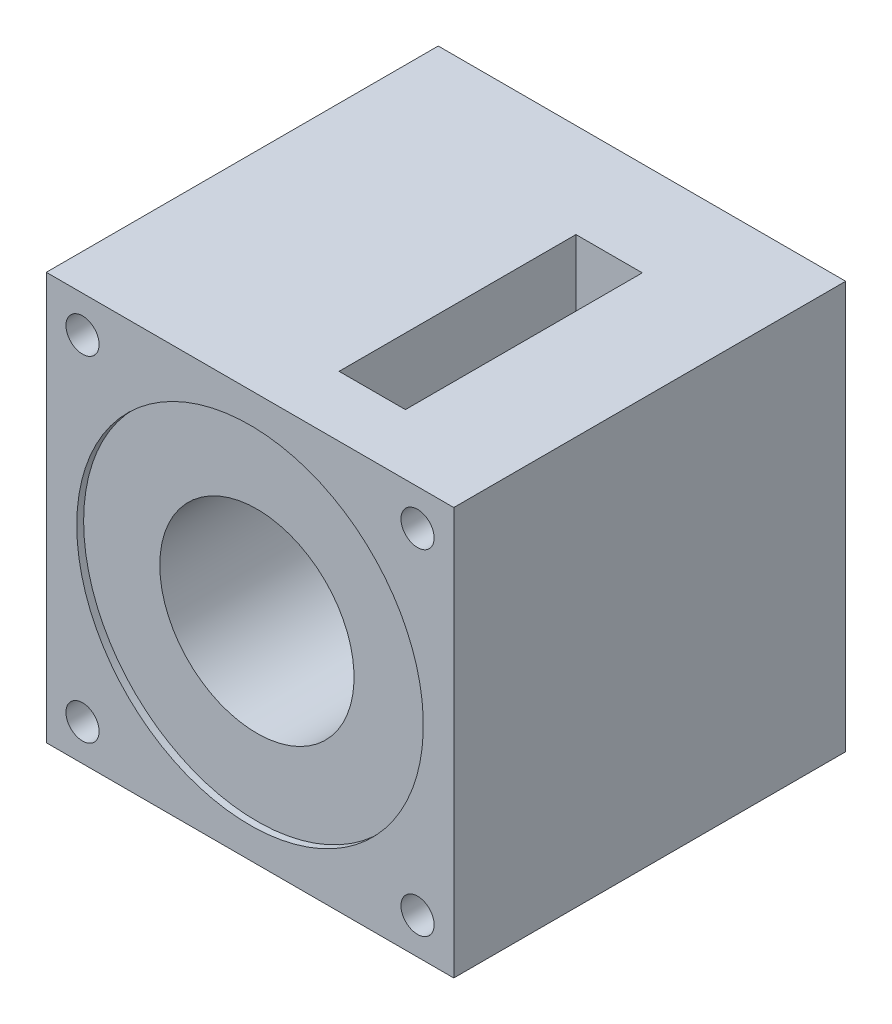
ISO-10303-21;
HEADER;
FILE_DESCRIPTION(('STEP AP214'),'2;1');
FILE_NAME('part.step','',(''),(''),'','','');
FILE_SCHEMA(('AUTOMOTIVE_DESIGN { 1 0 10303 214 1 1 1 1 }'));
ENDSEC;
DATA;
#1=APPLICATION_CONTEXT('core data for automotive mechanical design processes');
#2=APPLICATION_PROTOCOL_DEFINITION('international standard','automotive_design',2000,#1);
#3=PRODUCT_CONTEXT('',#1,'mechanical');
#4=PRODUCT('Part','Part','',(#3));
#5=PRODUCT_RELATED_PRODUCT_CATEGORY('part','',(#4));
#6=PRODUCT_DEFINITION_FORMATION('','',#4);
#7=PRODUCT_DEFINITION_CONTEXT('part definition',#1,'design');
#8=PRODUCT_DEFINITION('design','',#6,#7);
#9=PRODUCT_DEFINITION_SHAPE('','',#8);
#10=(LENGTH_UNIT() NAMED_UNIT(*) SI_UNIT(.MILLI.,.METRE.));
#11=(NAMED_UNIT(*) PLANE_ANGLE_UNIT() SI_UNIT($,.RADIAN.));
#12=(NAMED_UNIT(*) SI_UNIT($,.STERADIAN.) SOLID_ANGLE_UNIT());
#13=UNCERTAINTY_MEASURE_WITH_UNIT(LENGTH_MEASURE(1.E-05),#10,'distance_accuracy_value','');
#14=(GEOMETRIC_REPRESENTATION_CONTEXT(3) GLOBAL_UNCERTAINTY_ASSIGNED_CONTEXT((#13)) GLOBAL_UNIT_ASSIGNED_CONTEXT((#10,
#11,#12)) REPRESENTATION_CONTEXT('',''));
#15=CARTESIAN_POINT('',(0.,0.,0.));
#16=DIRECTION('',(0.,0.,1.));
#17=DIRECTION('',(1.,0.,0.));
#18=AXIS2_PLACEMENT_3D('',#15,#16,#17);
#19=CARTESIAN_POINT('',(-361.604600328338,151.580789289516,82.721));
#20=DIRECTION('',(-1.,0.,0.));
#21=DIRECTION('',(0.,0.,1.));
#22=AXIS2_PLACEMENT_3D('',#19,#20,#21);
#23=PLANE('',#22);
#24=DIRECTION('',(0.,1.,0.));
#25=VECTOR('',#24,1.);
#26=CARTESIAN_POINT('',(-361.604600328338,151.580789289516,0.));
#27=LINE('',#26,#25);
#28=CARTESIAN_POINT('',(-361.604600328338,151.580789289516,0.));
#29=VERTEX_POINT('',#28);
#30=CARTESIAN_POINT('',(-361.604600328338,237.580789289516,0.));
#31=VERTEX_POINT('',#30);
#32=EDGE_CURVE('E148',#29,#31,#27,.T.);
#33=ORIENTED_EDGE('',*,*,#32,.F.);
#34=DIRECTION('',(0.,0.,-1.));
#35=VECTOR('',#34,1.);
#36=CARTESIAN_POINT('',(-361.604600328338,151.580789289516,82.721));
#37=LINE('',#36,#35);
#38=CARTESIAN_POINT('',(-361.604600328338,151.580789289516,82.721));
#39=VERTEX_POINT('',#38);
#40=EDGE_CURVE('E11',#39,#29,#37,.T.);
#41=ORIENTED_EDGE('',*,*,#40,.F.);
#42=DIRECTION('',(0.,1.,0.));
#43=VECTOR('',#42,1.);
#44=CARTESIAN_POINT('',(-361.604600328338,151.580789289516,82.721));
#45=LINE('',#44,#43);
#46=CARTESIAN_POINT('',(-361.604600328338,237.580789289516,82.721));
#47=VERTEX_POINT('',#46);
#48=EDGE_CURVE('E151',#39,#47,#45,.T.);
#49=ORIENTED_EDGE('',*,*,#48,.T.);
#50=DIRECTION('',(0.,0.,-1.));
#51=VECTOR('',#50,1.);
#52=CARTESIAN_POINT('',(-361.604600328338,237.580789289516,82.721));
#53=LINE('',#52,#51);
#54=EDGE_CURVE('E164',#47,#31,#53,.T.);
#55=ORIENTED_EDGE('',*,*,#54,.T.);
#56=EDGE_LOOP('',(#33,#41,#49,#55));
#57=FACE_BOUND('',#56,.T.);
#58=ADVANCED_FACE('F35',(#57),#23,.T.);
#59=CARTESIAN_POINT('',(-275.604600328338,151.580789289516,82.721));
#60=DIRECTION('',(0.,-1.,0.));
#61=DIRECTION('',(0.,0.,-1.));
#62=AXIS2_PLACEMENT_3D('',#59,#60,#61);
#63=PLANE('',#62);
#64=DIRECTION('',(-1.,0.,0.));
#65=VECTOR('',#64,1.);
#66=CARTESIAN_POINT('',(-275.604600328338,151.580789289516,0.));
#67=LINE('',#66,#65);
#68=CARTESIAN_POINT('',(-275.604600328338,151.580789289516,0.));
#69=VERTEX_POINT('',#68);
#70=EDGE_CURVE('E155',#69,#29,#67,.T.);
#71=ORIENTED_EDGE('',*,*,#70,.F.);
#72=DIRECTION('',(0.,0.,-1.));
#73=VECTOR('',#72,1.);
#74=CARTESIAN_POINT('',(-275.604600328338,151.580789289516,82.721));
#75=LINE('',#74,#73);
#76=CARTESIAN_POINT('',(-275.604600328338,151.580789289516,82.721));
#77=VERTEX_POINT('',#76);
#78=EDGE_CURVE('E43',#77,#69,#75,.T.);
#79=ORIENTED_EDGE('',*,*,#78,.F.);
#80=DIRECTION('',(-1.,0.,0.));
#81=VECTOR('',#80,1.);
#82=CARTESIAN_POINT('',(-275.604600328338,151.580789289516,82.721));
#83=LINE('',#82,#81);
#84=EDGE_CURVE('E161',#77,#39,#83,.T.);
#85=ORIENTED_EDGE('',*,*,#84,.T.);
#86=ORIENTED_EDGE('',*,*,#40,.T.);
#87=EDGE_LOOP('',(#71,#79,#85,#86));
#88=FACE_BOUND('',#87,.T.);
#89=ADVANCED_FACE('F189',(#88),#63,.T.);
#90=CARTESIAN_POINT('',(-275.604600328338,237.580789289516,82.721));
#91=DIRECTION('',(1.,0.,0.));
#92=DIRECTION('',(0.,0.,-1.));
#93=AXIS2_PLACEMENT_3D('',#90,#91,#92);
#94=PLANE('',#93);
#95=DIRECTION('',(0.,-1.,0.));
#96=VECTOR('',#95,1.);
#97=CARTESIAN_POINT('',(-275.604600328338,237.580789289516,0.));
#98=LINE('',#97,#96);
#99=CARTESIAN_POINT('',(-275.604600328338,237.580789289516,0.));
#100=VERTEX_POINT('',#99);
#101=EDGE_CURVE('E170',#100,#69,#98,.T.);
#102=ORIENTED_EDGE('',*,*,#101,.F.);
#103=DIRECTION('',(0.,0.,-1.));
#104=VECTOR('',#103,1.);
#105=CARTESIAN_POINT('',(-275.604600328338,237.580789289516,82.721));
#106=LINE('',#105,#104);
#107=CARTESIAN_POINT('',(-275.604600328338,237.580789289516,82.721));
#108=VERTEX_POINT('',#107);
#109=EDGE_CURVE('E176',#108,#100,#106,.T.);
#110=ORIENTED_EDGE('',*,*,#109,.F.);
#111=DIRECTION('',(0.,-1.,0.));
#112=VECTOR('',#111,1.);
#113=CARTESIAN_POINT('',(-275.604600328338,237.580789289516,82.721));
#114=LINE('',#113,#112);
#115=EDGE_CURVE('E158',#108,#77,#114,.T.);
#116=ORIENTED_EDGE('',*,*,#115,.T.);
#117=ORIENTED_EDGE('',*,*,#78,.T.);
#118=EDGE_LOOP('',(#102,#110,#116,#117));
#119=FACE_BOUND('',#118,.T.);
#120=ADVANCED_FACE('F195',(#119),#94,.T.);
#121=CARTESIAN_POINT('',(-361.604600328338,237.580789289516,82.721));
#122=DIRECTION('',(0.,1.,0.));
#123=DIRECTION('',(0.,0.,1.));
#124=AXIS2_PLACEMENT_3D('',#121,#122,#123);
#125=PLANE('',#124);
#126=DIRECTION('',(0.,0.,1.));
#127=VECTOR('',#126,1.);
#128=CARTESIAN_POINT('',(-312.604600328338,237.580789289516,19.9307979365429));
#129=LINE('',#128,#127);
#130=CARTESIAN_POINT('',(-312.604600328338,237.580789289516,19.9307979365429));
#131=VERTEX_POINT('',#130);
#132=CARTESIAN_POINT('',(-312.604600328338,237.580789289516,69.9307979365429));
#133=VERTEX_POINT('',#132);
#134=EDGE_CURVE('E562',#131,#133,#129,.T.);
#135=ORIENTED_EDGE('',*,*,#134,.F.);
#136=DIRECTION('',(-1.,0.,0.));
#137=VECTOR('',#136,1.);
#138=CARTESIAN_POINT('',(-298.604600328338,237.580789289516,19.9307979365429));
#139=LINE('',#138,#137);
#140=CARTESIAN_POINT('',(-298.604600328338,237.580789289516,19.9307979365429));
#141=VERTEX_POINT('',#140);
#142=EDGE_CURVE('E120',#141,#131,#139,.T.);
#143=ORIENTED_EDGE('',*,*,#142,.F.);
#144=DIRECTION('',(0.,0.,-1.));
#145=VECTOR('',#144,1.);
#146=CARTESIAN_POINT('',(-298.604600328338,237.580789289516,69.9307979365429));
#147=LINE('',#146,#145);
#148=CARTESIAN_POINT('',(-298.604600328338,237.580789289516,69.9307979365429));
#149=VERTEX_POINT('',#148);
#150=EDGE_CURVE('E51',#149,#141,#147,.T.);
#151=ORIENTED_EDGE('',*,*,#150,.F.);
#152=DIRECTION('',(1.,0.,0.));
#153=VECTOR('',#152,1.);
#154=CARTESIAN_POINT('',(-312.604600328338,237.580789289516,69.9307979365429));
#155=LINE('',#154,#153);
#156=EDGE_CURVE('E560',#133,#149,#155,.T.);
#157=ORIENTED_EDGE('',*,*,#156,.F.);
#158=EDGE_LOOP('',(#135,#143,#151,#157));
#159=FACE_BOUND('',#158,.T.);
#160=DIRECTION('',(1.,0.,0.));
#161=VECTOR('',#160,1.);
#162=CARTESIAN_POINT('',(-361.604600328338,237.580789289516,0.));
#163=LINE('',#162,#161);
#164=EDGE_CURVE('E167',#31,#100,#163,.T.);
#165=ORIENTED_EDGE('',*,*,#164,.F.);
#166=ORIENTED_EDGE('',*,*,#54,.F.);
#167=DIRECTION('',(1.,0.,0.));
#168=VECTOR('',#167,1.);
#169=CARTESIAN_POINT('',(-361.604600328338,237.580789289516,82.721));
#170=LINE('',#169,#168);
#171=EDGE_CURVE('E154',#47,#108,#170,.T.);
#172=ORIENTED_EDGE('',*,*,#171,.T.);
#173=ORIENTED_EDGE('',*,*,#109,.T.);
#174=EDGE_LOOP('',(#165,#166,#172,#173));
#175=FACE_BOUND('',#174,.T.);
#176=ADVANCED_FACE('F183',(#159,#175),#125,.T.);
#177=CARTESIAN_POINT('',(0.,0.,82.721));
#178=DIRECTION('',(0.,0.,-1.));
#179=DIRECTION('',(-1.,0.,0.));
#180=AXIS2_PLACEMENT_3D('',#177,#178,#179);
#181=PLANE('',#180);
#182=CARTESIAN_POINT('',(-283.24926126901,159.225450230188,82.721));
#183=DIRECTION('',(0.,0.,1.));
#184=DIRECTION('',(1.,0.,0.));
#185=AXIS2_PLACEMENT_3D('',#182,#183,#184);
#186=CIRCLE('',#185,3.5);
#187=CARTESIAN_POINT('',(-279.74926126901,159.225450230188,82.721));
#188=VERTEX_POINT('',#187);
#189=EDGE_CURVE('E512',#188,#188,#186,.T.);
#190=ORIENTED_EDGE('',*,*,#189,.F.);
#191=EDGE_LOOP('',(#190));
#192=FACE_BOUND('',#191,.T.);
#193=CARTESIAN_POINT('',(-353.959939387665,229.936128348843,82.721));
#194=DIRECTION('',(0.,0.,1.));
#195=DIRECTION('',(1.,0.,0.));
#196=AXIS2_PLACEMENT_3D('',#193,#194,#195);
#197=CIRCLE('',#196,3.5);
#198=CARTESIAN_POINT('',(-350.459939387665,229.936128348843,82.721));
#199=VERTEX_POINT('',#198);
#200=EDGE_CURVE('E514',#199,#199,#197,.T.);
#201=ORIENTED_EDGE('',*,*,#200,.F.);
#202=EDGE_LOOP('',(#201));
#203=FACE_BOUND('',#202,.T.);
#204=CARTESIAN_POINT('',(-283.24926126901,229.936128348843,82.721));
#205=DIRECTION('',(0.,0.,1.));
#206=DIRECTION('',(1.,0.,0.));
#207=AXIS2_PLACEMENT_3D('',#204,#205,#206);
#208=CIRCLE('',#207,3.5);
#209=CARTESIAN_POINT('',(-279.74926126901,229.936128348843,82.721));
#210=VERTEX_POINT('',#209);
#211=EDGE_CURVE('E522',#210,#210,#208,.T.);
#212=ORIENTED_EDGE('',*,*,#211,.F.);
#213=EDGE_LOOP('',(#212));
#214=FACE_BOUND('',#213,.T.);
#215=CARTESIAN_POINT('',(-353.959939387665,159.225450230188,82.721));
#216=DIRECTION('',(0.,0.,1.));
#217=DIRECTION('',(1.,0.,0.));
#218=AXIS2_PLACEMENT_3D('',#215,#216,#217);
#219=CIRCLE('',#218,3.5);
#220=CARTESIAN_POINT('',(-350.459939387665,159.225450230188,82.721));
#221=VERTEX_POINT('',#220);
#222=EDGE_CURVE('E528',#221,#221,#219,.T.);
#223=ORIENTED_EDGE('',*,*,#222,.F.);
#224=EDGE_LOOP('',(#223));
#225=FACE_BOUND('',#224,.T.);
#226=CARTESIAN_POINT('',(-318.604600328338,194.580789289516,82.721));
#227=DIRECTION('',(0.,0.,1.));
#228=DIRECTION('',(-1.,0.,0.));
#229=AXIS2_PLACEMENT_3D('',#226,#227,#228);
#230=CIRCLE('',#229,36.575);
#231=CARTESIAN_POINT('',(-355.179600328338,194.580789289516,82.721));
#232=VERTEX_POINT('',#231);
#233=EDGE_CURVE('E142',#232,#232,#230,.T.);
#234=ORIENTED_EDGE('',*,*,#233,.F.);
#235=EDGE_LOOP('',(#234));
#236=FACE_BOUND('',#235,.T.);
#237=ORIENTED_EDGE('',*,*,#48,.F.);
#238=ORIENTED_EDGE('',*,*,#84,.F.);
#239=ORIENTED_EDGE('',*,*,#115,.F.);
#240=ORIENTED_EDGE('',*,*,#171,.F.);
#241=EDGE_LOOP('',(#237,#238,#239,#240));
#242=FACE_BOUND('',#241,.T.);
#243=ADVANCED_FACE('F192',(#192,#203,#214,#225,#236,#242),#181,.F.);
#244=CARTESIAN_POINT('',(0.,0.,0.));
#245=DIRECTION('',(0.,0.,-1.));
#246=DIRECTION('',(-1.,0.,0.));
#247=AXIS2_PLACEMENT_3D('',#244,#245,#246);
#248=PLANE('',#247);
#249=CARTESIAN_POINT('',(-283.604600328337,159.580789289516,0.));
#250=DIRECTION('',(0.,0.,-1.));
#251=DIRECTION('',(-1.,0.,0.));
#252=AXIS2_PLACEMENT_3D('',#249,#250,#251);
#253=CIRCLE('',#252,3.5);
#254=CARTESIAN_POINT('',(-287.104600328337,159.580789289516,0.));
#255=VERTEX_POINT('',#254);
#256=EDGE_CURVE('E534',#255,#255,#253,.T.);
#257=ORIENTED_EDGE('',*,*,#256,.F.);
#258=EDGE_LOOP('',(#257));
#259=FACE_BOUND('',#258,.T.);
#260=CARTESIAN_POINT('',(-283.604600328337,229.580789289516,0.));
#261=DIRECTION('',(0.,0.,-1.));
#262=DIRECTION('',(-1.,0.,0.));
#263=AXIS2_PLACEMENT_3D('',#260,#261,#262);
#264=CIRCLE('',#263,3.5);
#265=CARTESIAN_POINT('',(-287.104600328337,229.580789289516,0.));
#266=VERTEX_POINT('',#265);
#267=EDGE_CURVE('E540',#266,#266,#264,.T.);
#268=ORIENTED_EDGE('',*,*,#267,.F.);
#269=EDGE_LOOP('',(#268));
#270=FACE_BOUND('',#269,.T.);
#271=CARTESIAN_POINT('',(-353.604600328337,159.580789289516,0.));
#272=DIRECTION('',(0.,0.,-1.));
#273=DIRECTION('',(-1.,0.,0.));
#274=AXIS2_PLACEMENT_3D('',#271,#272,#273);
#275=CIRCLE('',#274,3.5);
#276=CARTESIAN_POINT('',(-357.104600328337,159.580789289516,0.));
#277=VERTEX_POINT('',#276);
#278=EDGE_CURVE('E546',#277,#277,#275,.T.);
#279=ORIENTED_EDGE('',*,*,#278,.F.);
#280=EDGE_LOOP('',(#279));
#281=FACE_BOUND('',#280,.T.);
#282=CARTESIAN_POINT('',(-353.604600328337,229.580789289516,0.));
#283=DIRECTION('',(0.,0.,-1.));
#284=DIRECTION('',(-1.,0.,0.));
#285=AXIS2_PLACEMENT_3D('',#282,#283,#284);
#286=CIRCLE('',#285,3.5);
#287=CARTESIAN_POINT('',(-357.104600328337,229.580789289516,0.));
#288=VERTEX_POINT('',#287);
#289=EDGE_CURVE('E552',#288,#288,#286,.T.);
#290=ORIENTED_EDGE('',*,*,#289,.F.);
#291=EDGE_LOOP('',(#290));
#292=FACE_BOUND('',#291,.T.);
#293=CARTESIAN_POINT('',(-318.604600328338,194.580789289516,0.));
#294=DIRECTION('',(0.,0.,-1.));
#295=DIRECTION('',(1.,0.,0.));
#296=AXIS2_PLACEMENT_3D('',#293,#294,#295);
#297=CIRCLE('',#296,18.5);
#298=CARTESIAN_POINT('',(-300.104600328338,194.580789289516,0.));
#299=VERTEX_POINT('',#298);
#300=EDGE_CURVE('E136',#299,#299,#297,.T.);
#301=ORIENTED_EDGE('',*,*,#300,.F.);
#302=EDGE_LOOP('',(#301));
#303=FACE_BOUND('',#302,.T.);
#304=ORIENTED_EDGE('',*,*,#32,.T.);
#305=ORIENTED_EDGE('',*,*,#164,.T.);
#306=ORIENTED_EDGE('',*,*,#101,.T.);
#307=ORIENTED_EDGE('',*,*,#70,.T.);
#308=EDGE_LOOP('',(#304,#305,#306,#307));
#309=FACE_BOUND('',#308,.T.);
#310=ADVANCED_FACE('F186',(#259,#270,#281,#292,#303,#309),#248,.T.);
#311=CARTESIAN_POINT('',(-318.604600328338,194.580789289516,81.2710059631452));
#312=DIRECTION('',(0.,0.,1.));
#313=DIRECTION('',(1.,0.,0.));
#314=AXIS2_PLACEMENT_3D('',#311,#312,#313);
#315=CYLINDRICAL_SURFACE('',#314,36.575);
#316=CARTESIAN_POINT('',(-318.604600328338,194.580789289516,81.2710059631452));
#317=DIRECTION('',(0.,0.,1.));
#318=DIRECTION('',(-1.,0.,0.));
#319=AXIS2_PLACEMENT_3D('',#316,#317,#318);
#320=CIRCLE('',#319,36.575);
#321=CARTESIAN_POINT('',(-355.179600328338,194.580789289516,81.2710059631452));
#322=VERTEX_POINT('',#321);
#323=EDGE_CURVE('E145',#322,#322,#320,.T.);
#324=ORIENTED_EDGE('',*,*,#323,.F.);
#325=EDGE_LOOP('',(#324));
#326=FACE_BOUND('',#325,.T.);
#327=ORIENTED_EDGE('',*,*,#233,.T.);
#328=EDGE_LOOP('',(#327));
#329=FACE_BOUND('',#328,.T.);
#330=ADVANCED_FACE('F221',(#326,#329),#315,.F.);
#331=CARTESIAN_POINT('',(-318.604600328338,194.580789289516,81.2710059631452));
#332=DIRECTION('',(0.,0.,-1.));
#333=DIRECTION('',(-1.,0.,0.));
#334=AXIS2_PLACEMENT_3D('',#331,#332,#333);
#335=PLANE('',#334);
#336=CARTESIAN_POINT('',(-318.604600328338,194.580789289516,81.2710059631452));
#337=DIRECTION('',(0.,0.,1.));
#338=DIRECTION('',(-1.,0.,0.));
#339=AXIS2_PLACEMENT_3D('',#336,#337,#338);
#340=CIRCLE('',#339,20.5);
#341=CARTESIAN_POINT('',(-339.104600328338,194.580789289516,81.2710059631452));
#342=VERTEX_POINT('',#341);
#343=EDGE_CURVE('E135',#342,#342,#340,.T.);
#344=ORIENTED_EDGE('',*,*,#343,.F.);
#345=EDGE_LOOP('',(#344));
#346=FACE_BOUND('',#345,.T.);
#347=ORIENTED_EDGE('',*,*,#323,.T.);
#348=EDGE_LOOP('',(#347));
#349=FACE_BOUND('',#348,.T.);
#350=ADVANCED_FACE('F226',(#346,#349),#335,.F.);
#351=CARTESIAN_POINT('',(-318.604600328338,194.580789289516,19.7710059631452));
#352=DIRECTION('',(0.,0.,1.));
#353=DIRECTION('',(1.,0.,0.));
#354=AXIS2_PLACEMENT_3D('',#351,#352,#353);
#355=CYLINDRICAL_SURFACE('',#354,20.5);
#356=CARTESIAN_POINT('',(-318.604600328338,194.580789289516,19.9307979365429));
#357=DIRECTION('',(0.,0.,-1.));
#358=DIRECTION('',(-1.,0.,0.));
#359=AXIS2_PLACEMENT_3D('',#356,#357,#358);
#360=CIRCLE('',#359,20.5);
#361=CARTESIAN_POINT('',(-312.604600328338,214.183085073429,19.9307979365429));
#362=VERTEX_POINT('',#361);
#363=CARTESIAN_POINT('',(-298.604600328338,199.080789289516,19.9307979365429));
#364=VERTEX_POINT('',#363);
#365=EDGE_CURVE('E111',#362,#364,#360,.T.);
#366=ORIENTED_EDGE('',*,*,#365,.F.);
#367=DIRECTION('',(0.,0.,1.));
#368=VECTOR('',#367,1.);
#369=CARTESIAN_POINT('',(-312.604600328338,214.183085073429,19.7710059631452));
#370=LINE('',#369,#368);
#371=CARTESIAN_POINT('',(-312.604600328338,214.183085073429,69.9307979365429));
#372=VERTEX_POINT('',#371);
#373=EDGE_CURVE('E59',#372,#362,#370,.F.);
#374=ORIENTED_EDGE('',*,*,#373,.F.);
#375=CARTESIAN_POINT('',(-318.604600328338,194.580789289516,69.9307979365429));
#376=DIRECTION('',(0.,0.,1.));
#377=DIRECTION('',(1.,0.,0.));
#378=AXIS2_PLACEMENT_3D('',#375,#376,#377);
#379=CIRCLE('',#378,20.5);
#380=CARTESIAN_POINT('',(-298.604600328338,199.080789289516,69.9307979365429));
#381=VERTEX_POINT('',#380);
#382=EDGE_CURVE('E118',#381,#372,#379,.T.);
#383=ORIENTED_EDGE('',*,*,#382,.F.);
#384=DIRECTION('',(0.,0.,1.));
#385=VECTOR('',#384,1.);
#386=CARTESIAN_POINT('',(-298.604600328338,199.080789289516,19.7710059631452));
#387=LINE('',#386,#385);
#388=EDGE_CURVE('E102',#364,#381,#387,.T.);
#389=ORIENTED_EDGE('',*,*,#388,.F.);
#390=EDGE_LOOP('',(#366,#374,#383,#389));
#391=FACE_BOUND('',#390,.T.);
#392=CARTESIAN_POINT('',(-318.604600328338,194.580789289516,19.7710059631452));
#393=DIRECTION('',(0.,0.,1.));
#394=DIRECTION('',(-1.,0.,0.));
#395=AXIS2_PLACEMENT_3D('',#392,#393,#394);
#396=CIRCLE('',#395,20.5);
#397=CARTESIAN_POINT('',(-339.104600328338,194.580789289516,19.7710059631452));
#398=VERTEX_POINT('',#397);
#399=EDGE_CURVE('E139',#398,#398,#396,.T.);
#400=ORIENTED_EDGE('',*,*,#399,.F.);
#401=EDGE_LOOP('',(#400));
#402=FACE_BOUND('',#401,.T.);
#403=ORIENTED_EDGE('',*,*,#343,.T.);
#404=EDGE_LOOP('',(#403));
#405=FACE_BOUND('',#404,.T.);
#406=ADVANCED_FACE('F115',(#391,#402,#405),#355,.F.);
#407=CARTESIAN_POINT('',(-318.604600328338,194.580789289516,19.7710059631452));
#408=DIRECTION('',(0.,0.,-1.));
#409=DIRECTION('',(-1.,0.,0.));
#410=AXIS2_PLACEMENT_3D('',#407,#408,#409);
#411=PLANE('',#410);
#412=CARTESIAN_POINT('',(-318.604600328338,194.580789289516,19.7710059631452));
#413=DIRECTION('',(0.,0.,1.));
#414=DIRECTION('',(-1.,0.,0.));
#415=AXIS2_PLACEMENT_3D('',#412,#413,#414);
#416=CIRCLE('',#415,7.50000000000001);
#417=CARTESIAN_POINT('',(-326.104600328338,194.580789289516,19.7710059631452));
#418=VERTEX_POINT('',#417);
#419=EDGE_CURVE('E128',#418,#418,#416,.T.);
#420=ORIENTED_EDGE('',*,*,#419,.F.);
#421=EDGE_LOOP('',(#420));
#422=FACE_BOUND('',#421,.T.);
#423=ORIENTED_EDGE('',*,*,#399,.T.);
#424=EDGE_LOOP('',(#423));
#425=FACE_BOUND('',#424,.T.);
#426=ADVANCED_FACE('F251',(#422,#425),#411,.F.);
#427=CARTESIAN_POINT('',(-318.604600328338,194.580789289516,12.5));
#428=DIRECTION('',(0.,0.,-1.));
#429=DIRECTION('',(-1.,0.,0.));
#430=AXIS2_PLACEMENT_3D('',#427,#428,#429);
#431=CYLINDRICAL_SURFACE('',#430,18.5);
#432=CARTESIAN_POINT('',(-318.604600328338,194.580789289516,12.5));
#433=DIRECTION('',(0.,0.,-1.));
#434=DIRECTION('',(1.,0.,0.));
#435=AXIS2_PLACEMENT_3D('',#432,#433,#434);
#436=CIRCLE('',#435,18.5);
#437=CARTESIAN_POINT('',(-300.104600328338,194.580789289516,12.5));
#438=VERTEX_POINT('',#437);
#439=EDGE_CURVE('E132',#438,#438,#436,.T.);
#440=ORIENTED_EDGE('',*,*,#439,.F.);
#441=EDGE_LOOP('',(#440));
#442=FACE_BOUND('',#441,.T.);
#443=ORIENTED_EDGE('',*,*,#300,.T.);
#444=EDGE_LOOP('',(#443));
#445=FACE_BOUND('',#444,.T.);
#446=ADVANCED_FACE('F245',(#442,#445),#431,.F.);
#447=CARTESIAN_POINT('',(-318.604600328338,194.580789289516,12.5));
#448=DIRECTION('',(0.,0.,1.));
#449=DIRECTION('',(1.,0.,0.));
#450=AXIS2_PLACEMENT_3D('',#447,#448,#449);
#451=PLANE('',#450);
#452=CARTESIAN_POINT('',(-318.604600328338,194.580789289516,12.5));
#453=DIRECTION('',(0.,0.,1.));
#454=DIRECTION('',(1.,0.,0.));
#455=AXIS2_PLACEMENT_3D('',#452,#453,#454);
#456=CIRCLE('',#455,7.50000000000001);
#457=CARTESIAN_POINT('',(-311.104600328338,194.580789289516,12.5));
#458=VERTEX_POINT('',#457);
#459=EDGE_CURVE('E38',#458,#458,#456,.T.);
#460=ORIENTED_EDGE('',*,*,#459,.T.);
#461=EDGE_LOOP('',(#460));
#462=FACE_BOUND('',#461,.T.);
#463=ORIENTED_EDGE('',*,*,#439,.T.);
#464=EDGE_LOOP('',(#463));
#465=FACE_BOUND('',#464,.T.);
#466=ADVANCED_FACE('F250',(#462,#465),#451,.F.);
#467=CARTESIAN_POINT('',(-318.604600328338,194.580789289516,0.));
#468=DIRECTION('',(0.,0.,1.));
#469=DIRECTION('',(1.,0.,0.));
#470=AXIS2_PLACEMENT_3D('',#467,#468,#469);
#471=CYLINDRICAL_SURFACE('',#470,7.50000000000001);
#472=ORIENTED_EDGE('',*,*,#419,.T.);
#473=EDGE_LOOP('',(#472));
#474=FACE_BOUND('',#473,.T.);
#475=ORIENTED_EDGE('',*,*,#459,.F.);
#476=EDGE_LOOP('',(#475));
#477=FACE_BOUND('',#476,.T.);
#478=ADVANCED_FACE('F270',(#474,#477),#471,.F.);
#479=CARTESIAN_POINT('',(-312.604600328338,151.579789289516,19.9307979365429));
#480=DIRECTION('',(-1.,0.,0.));
#481=DIRECTION('',(0.,0.,1.));
#482=AXIS2_PLACEMENT_3D('',#479,#480,#481);
#483=PLANE('',#482);
#484=ORIENTED_EDGE('',*,*,#373,.T.);
#485=DIRECTION('',(0.,1.,0.));
#486=VECTOR('',#485,1.);
#487=CARTESIAN_POINT('',(-312.604600328338,151.579789289516,19.9307979365429));
#488=LINE('',#487,#486);
#489=EDGE_CURVE('E107',#362,#131,#488,.T.);
#490=ORIENTED_EDGE('',*,*,#489,.T.);
#491=ORIENTED_EDGE('',*,*,#134,.T.);
#492=DIRECTION('',(0.,1.,0.));
#493=VECTOR('',#492,1.);
#494=CARTESIAN_POINT('',(-312.604600328338,151.579789289516,69.9307979365429));
#495=LINE('',#494,#493);
#496=EDGE_CURVE('E126',#372,#133,#495,.T.);
#497=ORIENTED_EDGE('',*,*,#496,.F.);
#498=EDGE_LOOP('',(#484,#490,#491,#497));
#499=FACE_BOUND('',#498,.T.);
#500=ADVANCED_FACE('F280',(#499),#483,.F.);
#501=CARTESIAN_POINT('',(-312.604600328338,151.579789289516,69.9307979365429));
#502=DIRECTION('',(0.,0.,1.));
#503=DIRECTION('',(1.,0.,0.));
#504=AXIS2_PLACEMENT_3D('',#501,#502,#503);
#505=PLANE('',#504);
#506=ORIENTED_EDGE('',*,*,#382,.T.);
#507=ORIENTED_EDGE('',*,*,#496,.T.);
#508=ORIENTED_EDGE('',*,*,#156,.T.);
#509=DIRECTION('',(0.,1.,0.));
#510=VECTOR('',#509,1.);
#511=CARTESIAN_POINT('',(-298.604600328338,151.579789289516,69.9307979365429));
#512=LINE('',#511,#510);
#513=EDGE_CURVE('E108',#381,#149,#512,.T.);
#514=ORIENTED_EDGE('',*,*,#513,.F.);
#515=EDGE_LOOP('',(#506,#507,#508,#514));
#516=FACE_BOUND('',#515,.T.);
#517=ADVANCED_FACE('F303',(#516),#505,.F.);
#518=CARTESIAN_POINT('',(-298.604600328338,151.579789289516,69.9307979365429));
#519=DIRECTION('',(1.,0.,0.));
#520=DIRECTION('',(0.,0.,-1.));
#521=AXIS2_PLACEMENT_3D('',#518,#519,#520);
#522=PLANE('',#521);
#523=ORIENTED_EDGE('',*,*,#388,.T.);
#524=ORIENTED_EDGE('',*,*,#513,.T.);
#525=ORIENTED_EDGE('',*,*,#150,.T.);
#526=DIRECTION('',(0.,1.,0.));
#527=VECTOR('',#526,1.);
#528=CARTESIAN_POINT('',(-298.604600328338,151.579789289516,19.9307979365429));
#529=LINE('',#528,#527);
#530=EDGE_CURVE('E98',#364,#141,#529,.T.);
#531=ORIENTED_EDGE('',*,*,#530,.F.);
#532=EDGE_LOOP('',(#523,#524,#525,#531));
#533=FACE_BOUND('',#532,.T.);
#534=ADVANCED_FACE('F100',(#533),#522,.F.);
#535=CARTESIAN_POINT('',(-298.604600328338,151.579789289516,19.9307979365429));
#536=DIRECTION('',(0.,0.,-1.));
#537=DIRECTION('',(-1.,0.,0.));
#538=AXIS2_PLACEMENT_3D('',#535,#536,#537);
#539=PLANE('',#538);
#540=ORIENTED_EDGE('',*,*,#365,.T.);
#541=ORIENTED_EDGE('',*,*,#530,.T.);
#542=ORIENTED_EDGE('',*,*,#142,.T.);
#543=ORIENTED_EDGE('',*,*,#489,.F.);
#544=EDGE_LOOP('',(#540,#541,#542,#543));
#545=FACE_BOUND('',#544,.T.);
#546=ADVANCED_FACE('F112',(#545),#539,.F.);
#547=CARTESIAN_POINT('',(-353.604600328337,229.580789289516,22.));
#548=DIRECTION('',(0.,0.,1.));
#549=DIRECTION('',(1.,0.,0.));
#550=AXIS2_PLACEMENT_3D('',#547,#548,#549);
#551=PLANE('',#550);
#552=CARTESIAN_POINT('',(-353.604600328337,229.580789289516,22.));
#553=DIRECTION('',(0.,0.,-1.));
#554=DIRECTION('',(-1.,0.,0.));
#555=AXIS2_PLACEMENT_3D('',#552,#553,#554);
#556=CIRCLE('',#555,3.5);
#557=CARTESIAN_POINT('',(-357.104600328337,229.580789289516,22.));
#558=VERTEX_POINT('',#557);
#559=EDGE_CURVE('E555',#558,#558,#556,.T.);
#560=ORIENTED_EDGE('',*,*,#559,.T.);
#561=EDGE_LOOP('',(#560));
#562=FACE_BOUND('',#561,.T.);
#563=ADVANCED_FACE('F329',(#562),#551,.F.);
#564=CARTESIAN_POINT('',(-353.604600328337,229.580789289516,0.));
#565=DIRECTION('',(0.,0.,-1.));
#566=DIRECTION('',(-1.,0.,0.));
#567=AXIS2_PLACEMENT_3D('',#564,#565,#566);
#568=CYLINDRICAL_SURFACE('',#567,3.5);
#569=ORIENTED_EDGE('',*,*,#559,.F.);
#570=EDGE_LOOP('',(#569));
#571=FACE_BOUND('',#570,.T.);
#572=ORIENTED_EDGE('',*,*,#289,.T.);
#573=EDGE_LOOP('',(#572));
#574=FACE_BOUND('',#573,.T.);
#575=ADVANCED_FACE('F345',(#571,#574),#568,.F.);
#576=CARTESIAN_POINT('',(-353.604600328337,159.580789289516,22.));
#577=DIRECTION('',(0.,0.,1.));
#578=DIRECTION('',(1.,0.,0.));
#579=AXIS2_PLACEMENT_3D('',#576,#577,#578);
#580=PLANE('',#579);
#581=CARTESIAN_POINT('',(-353.604600328337,159.580789289516,22.));
#582=DIRECTION('',(0.,0.,-1.));
#583=DIRECTION('',(-1.,0.,0.));
#584=AXIS2_PLACEMENT_3D('',#581,#582,#583);
#585=CIRCLE('',#584,3.5);
#586=CARTESIAN_POINT('',(-357.104600328337,159.580789289516,22.));
#587=VERTEX_POINT('',#586);
#588=EDGE_CURVE('E549',#587,#587,#585,.T.);
#589=ORIENTED_EDGE('',*,*,#588,.T.);
#590=EDGE_LOOP('',(#589));
#591=FACE_BOUND('',#590,.T.);
#592=ADVANCED_FACE('F355',(#591),#580,.F.);
#593=CARTESIAN_POINT('',(-353.604600328337,159.580789289516,0.));
#594=DIRECTION('',(0.,0.,-1.));
#595=DIRECTION('',(-1.,0.,0.));
#596=AXIS2_PLACEMENT_3D('',#593,#594,#595);
#597=CYLINDRICAL_SURFACE('',#596,3.5);
#598=ORIENTED_EDGE('',*,*,#588,.F.);
#599=EDGE_LOOP('',(#598));
#600=FACE_BOUND('',#599,.T.);
#601=ORIENTED_EDGE('',*,*,#278,.T.);
#602=EDGE_LOOP('',(#601));
#603=FACE_BOUND('',#602,.T.);
#604=ADVANCED_FACE('F365',(#600,#603),#597,.F.);
#605=CARTESIAN_POINT('',(-283.604600328337,229.580789289516,22.));
#606=DIRECTION('',(0.,0.,1.));
#607=DIRECTION('',(1.,0.,0.));
#608=AXIS2_PLACEMENT_3D('',#605,#606,#607);
#609=PLANE('',#608);
#610=CARTESIAN_POINT('',(-283.604600328337,229.580789289516,22.));
#611=DIRECTION('',(0.,0.,-1.));
#612=DIRECTION('',(-1.,0.,0.));
#613=AXIS2_PLACEMENT_3D('',#610,#611,#612);
#614=CIRCLE('',#613,3.5);
#615=CARTESIAN_POINT('',(-287.104600328337,229.580789289516,22.));
#616=VERTEX_POINT('',#615);
#617=EDGE_CURVE('E543',#616,#616,#614,.T.);
#618=ORIENTED_EDGE('',*,*,#617,.T.);
#619=EDGE_LOOP('',(#618));
#620=FACE_BOUND('',#619,.T.);
#621=ADVANCED_FACE('F375',(#620),#609,.F.);
#622=CARTESIAN_POINT('',(-283.604600328337,229.580789289516,0.));
#623=DIRECTION('',(0.,0.,-1.));
#624=DIRECTION('',(-1.,0.,0.));
#625=AXIS2_PLACEMENT_3D('',#622,#623,#624);
#626=CYLINDRICAL_SURFACE('',#625,3.5);
#627=ORIENTED_EDGE('',*,*,#617,.F.);
#628=EDGE_LOOP('',(#627));
#629=FACE_BOUND('',#628,.T.);
#630=ORIENTED_EDGE('',*,*,#267,.T.);
#631=EDGE_LOOP('',(#630));
#632=FACE_BOUND('',#631,.T.);
#633=ADVANCED_FACE('F385',(#629,#632),#626,.F.);
#634=CARTESIAN_POINT('',(-283.604600328337,159.580789289516,22.));
#635=DIRECTION('',(0.,0.,1.));
#636=DIRECTION('',(1.,0.,0.));
#637=AXIS2_PLACEMENT_3D('',#634,#635,#636);
#638=PLANE('',#637);
#639=CARTESIAN_POINT('',(-283.604600328337,159.580789289516,22.));
#640=DIRECTION('',(0.,0.,-1.));
#641=DIRECTION('',(-1.,0.,0.));
#642=AXIS2_PLACEMENT_3D('',#639,#640,#641);
#643=CIRCLE('',#642,3.5);
#644=CARTESIAN_POINT('',(-287.104600328337,159.580789289516,22.));
#645=VERTEX_POINT('',#644);
#646=EDGE_CURVE('E537',#645,#645,#643,.T.);
#647=ORIENTED_EDGE('',*,*,#646,.T.);
#648=EDGE_LOOP('',(#647));
#649=FACE_BOUND('',#648,.T.);
#650=ADVANCED_FACE('F395',(#649),#638,.F.);
#651=CARTESIAN_POINT('',(-283.604600328337,159.580789289516,0.));
#652=DIRECTION('',(0.,0.,-1.));
#653=DIRECTION('',(-1.,0.,0.));
#654=AXIS2_PLACEMENT_3D('',#651,#652,#653);
#655=CYLINDRICAL_SURFACE('',#654,3.5);
#656=ORIENTED_EDGE('',*,*,#646,.F.);
#657=EDGE_LOOP('',(#656));
#658=FACE_BOUND('',#657,.T.);
#659=ORIENTED_EDGE('',*,*,#256,.T.);
#660=EDGE_LOOP('',(#659));
#661=FACE_BOUND('',#660,.T.);
#662=ADVANCED_FACE('F405',(#658,#661),#655,.F.);
#663=CARTESIAN_POINT('',(-353.959939387665,159.225450230188,57.720787139377));
#664=DIRECTION('',(0.,0.,-1.));
#665=DIRECTION('',(-1.,0.,0.));
#666=AXIS2_PLACEMENT_3D('',#663,#664,#665);
#667=PLANE('',#666);
#668=CARTESIAN_POINT('',(-353.959939387665,159.225450230188,57.720787139377));
#669=DIRECTION('',(0.,0.,1.));
#670=DIRECTION('',(1.,0.,0.));
#671=AXIS2_PLACEMENT_3D('',#668,#669,#670);
#672=CIRCLE('',#671,3.5);
#673=CARTESIAN_POINT('',(-350.459939387665,159.225450230188,57.720787139377));
#674=VERTEX_POINT('',#673);
#675=EDGE_CURVE('E531',#674,#674,#672,.T.);
#676=ORIENTED_EDGE('',*,*,#675,.T.);
#677=EDGE_LOOP('',(#676));
#678=FACE_BOUND('',#677,.T.);
#679=ADVANCED_FACE('F415',(#678),#667,.F.);
#680=CARTESIAN_POINT('',(-353.959939387665,159.225450230188,82.721));
#681=DIRECTION('',(0.,0.,1.));
#682=DIRECTION('',(1.,0.,0.));
#683=AXIS2_PLACEMENT_3D('',#680,#681,#682);
#684=CYLINDRICAL_SURFACE('',#683,3.5);
#685=ORIENTED_EDGE('',*,*,#675,.F.);
#686=EDGE_LOOP('',(#685));
#687=FACE_BOUND('',#686,.T.);
#688=ORIENTED_EDGE('',*,*,#222,.T.);
#689=EDGE_LOOP('',(#688));
#690=FACE_BOUND('',#689,.T.);
#691=ADVANCED_FACE('F432',(#687,#690),#684,.F.);
#692=CARTESIAN_POINT('',(-283.24926126901,229.936128348843,57.720787139377));
#693=DIRECTION('',(0.,0.,-1.));
#694=DIRECTION('',(-1.,0.,0.));
#695=AXIS2_PLACEMENT_3D('',#692,#693,#694);
#696=PLANE('',#695);
#697=CARTESIAN_POINT('',(-283.24926126901,229.936128348843,57.720787139377));
#698=DIRECTION('',(0.,0.,1.));
#699=DIRECTION('',(1.,0.,0.));
#700=AXIS2_PLACEMENT_3D('',#697,#698,#699);
#701=CIRCLE('',#700,3.5);
#702=CARTESIAN_POINT('',(-279.74926126901,229.936128348843,57.720787139377));
#703=VERTEX_POINT('',#702);
#704=EDGE_CURVE('E525',#703,#703,#701,.T.);
#705=ORIENTED_EDGE('',*,*,#704,.T.);
#706=EDGE_LOOP('',(#705));
#707=FACE_BOUND('',#706,.T.);
#708=ADVANCED_FACE('F442',(#707),#696,.F.);
#709=CARTESIAN_POINT('',(-283.24926126901,229.936128348843,82.721));
#710=DIRECTION('',(0.,0.,1.));
#711=DIRECTION('',(1.,0.,0.));
#712=AXIS2_PLACEMENT_3D('',#709,#710,#711);
#713=CYLINDRICAL_SURFACE('',#712,3.5);
#714=ORIENTED_EDGE('',*,*,#704,.F.);
#715=EDGE_LOOP('',(#714));
#716=FACE_BOUND('',#715,.T.);
#717=ORIENTED_EDGE('',*,*,#211,.T.);
#718=EDGE_LOOP('',(#717));
#719=FACE_BOUND('',#718,.T.);
#720=ADVANCED_FACE('F452',(#716,#719),#713,.F.);
#721=CARTESIAN_POINT('',(-353.959939387665,229.936128348843,57.720787139377));
#722=DIRECTION('',(0.,0.,-1.));
#723=DIRECTION('',(-1.,0.,0.));
#724=AXIS2_PLACEMENT_3D('',#721,#722,#723);
#725=PLANE('',#724);
#726=CARTESIAN_POINT('',(-353.959939387665,229.936128348843,57.720787139377));
#727=DIRECTION('',(0.,0.,1.));
#728=DIRECTION('',(1.,0.,0.));
#729=AXIS2_PLACEMENT_3D('',#726,#727,#728);
#730=CIRCLE('',#729,3.5);
#731=CARTESIAN_POINT('',(-350.459939387665,229.936128348843,57.720787139377));
#732=VERTEX_POINT('',#731);
#733=EDGE_CURVE('E519',#732,#732,#730,.T.);
#734=ORIENTED_EDGE('',*,*,#733,.T.);
#735=EDGE_LOOP('',(#734));
#736=FACE_BOUND('',#735,.T.);
#737=ADVANCED_FACE('F462',(#736),#725,.F.);
#738=CARTESIAN_POINT('',(-353.959939387665,229.936128348843,82.721));
#739=DIRECTION('',(0.,0.,1.));
#740=DIRECTION('',(1.,0.,0.));
#741=AXIS2_PLACEMENT_3D('',#738,#739,#740);
#742=CYLINDRICAL_SURFACE('',#741,3.5);
#743=ORIENTED_EDGE('',*,*,#733,.F.);
#744=EDGE_LOOP('',(#743));
#745=FACE_BOUND('',#744,.T.);
#746=ORIENTED_EDGE('',*,*,#200,.T.);
#747=EDGE_LOOP('',(#746));
#748=FACE_BOUND('',#747,.T.);
#749=ADVANCED_FACE('F472',(#745,#748),#742,.F.);
#750=CARTESIAN_POINT('',(-283.24926126901,159.225450230188,57.720787139377));
#751=DIRECTION('',(0.,0.,-1.));
#752=DIRECTION('',(-1.,0.,0.));
#753=AXIS2_PLACEMENT_3D('',#750,#751,#752);
#754=PLANE('',#753);
#755=CARTESIAN_POINT('',(-283.24926126901,159.225450230188,57.720787139377));
#756=DIRECTION('',(0.,0.,1.));
#757=DIRECTION('',(1.,0.,0.));
#758=AXIS2_PLACEMENT_3D('',#755,#756,#757);
#759=CIRCLE('',#758,3.5);
#760=CARTESIAN_POINT('',(-279.74926126901,159.225450230188,57.720787139377));
#761=VERTEX_POINT('',#760);
#762=EDGE_CURVE('E509',#761,#761,#759,.T.);
#763=ORIENTED_EDGE('',*,*,#762,.T.);
#764=EDGE_LOOP('',(#763));
#765=FACE_BOUND('',#764,.T.);
#766=ADVANCED_FACE('F482',(#765),#754,.F.);
#767=CARTESIAN_POINT('',(-283.24926126901,159.225450230188,82.721));
#768=DIRECTION('',(0.,0.,1.));
#769=DIRECTION('',(1.,0.,0.));
#770=AXIS2_PLACEMENT_3D('',#767,#768,#769);
#771=CYLINDRICAL_SURFACE('',#770,3.5);
#772=ORIENTED_EDGE('',*,*,#762,.F.);
#773=EDGE_LOOP('',(#772));
#774=FACE_BOUND('',#773,.T.);
#775=ORIENTED_EDGE('',*,*,#189,.T.);
#776=EDGE_LOOP('',(#775));
#777=FACE_BOUND('',#776,.T.);
#778=ADVANCED_FACE('F492',(#774,#777),#771,.F.);
#779=CLOSED_SHELL('',(#58,#89,#120,#176,#243,#310,#330,#350,#406,#426,#446,#466,#478,#500,#517,
#534,#546,#563,#575,#592,#604,#621,#633,#650,#662,#679,#691,#708,#720,#737,#749,#766,#778));
#780=MANIFOLD_SOLID_BREP('B2',#779);
#781=ADVANCED_BREP_SHAPE_REPRESENTATION('',(#18,#780),#14);
#782=SHAPE_DEFINITION_REPRESENTATION(#9,#781);
ENDSEC;
END-ISO-10303-21;
